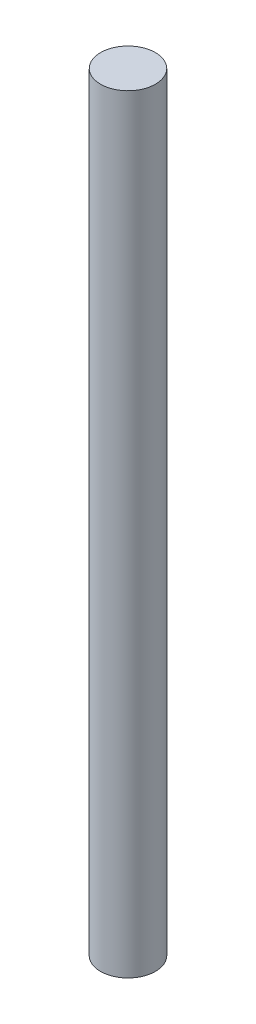
ISO-10303-21;
HEADER;
FILE_DESCRIPTION(('STEP AP214'),'2;1');
FILE_NAME('part.step','',(''),(''),'','','');
FILE_SCHEMA(('AUTOMOTIVE_DESIGN { 1 0 10303 214 1 1 1 1 }'));
ENDSEC;
DATA;
#1=APPLICATION_CONTEXT('core data for automotive mechanical design processes');
#2=APPLICATION_PROTOCOL_DEFINITION('international standard','automotive_design',2000,#1);
#3=PRODUCT_CONTEXT('',#1,'mechanical');
#4=PRODUCT('Part','Part','',(#3));
#5=PRODUCT_RELATED_PRODUCT_CATEGORY('part','',(#4));
#6=PRODUCT_DEFINITION_FORMATION('','',#4);
#7=PRODUCT_DEFINITION_CONTEXT('part definition',#1,'design');
#8=PRODUCT_DEFINITION('design','',#6,#7);
#9=PRODUCT_DEFINITION_SHAPE('','',#8);
#10=(LENGTH_UNIT() NAMED_UNIT(*) SI_UNIT(.MILLI.,.METRE.));
#11=(NAMED_UNIT(*) PLANE_ANGLE_UNIT() SI_UNIT($,.RADIAN.));
#12=(NAMED_UNIT(*) SI_UNIT($,.STERADIAN.) SOLID_ANGLE_UNIT());
#13=UNCERTAINTY_MEASURE_WITH_UNIT(LENGTH_MEASURE(1.E-05),#10,'distance_accuracy_value','');
#14=(GEOMETRIC_REPRESENTATION_CONTEXT(3) GLOBAL_UNCERTAINTY_ASSIGNED_CONTEXT((#13)) GLOBAL_UNIT_ASSIGNED_CONTEXT((#10,
#11,#12)) REPRESENTATION_CONTEXT('',''));
#15=CARTESIAN_POINT('',(0.,0.,0.));
#16=DIRECTION('',(0.,0.,1.));
#17=DIRECTION('',(1.,0.,0.));
#18=AXIS2_PLACEMENT_3D('',#15,#16,#17);
#19=CARTESIAN_POINT('',(0.,66.689,0.));
#20=DIRECTION('',(0.,-1.,0.));
#21=DIRECTION('',(0.,0.,-1.));
#22=AXIS2_PLACEMENT_3D('',#19,#20,#21);
#23=CYLINDRICAL_SURFACE('',#22,2.38);
#24=CARTESIAN_POINT('',(0.,66.689,0.));
#25=DIRECTION('',(0.,1.,0.));
#26=DIRECTION('',(0.,0.,1.));
#27=AXIS2_PLACEMENT_3D('',#24,#25,#26);
#28=CIRCLE('',#27,2.38);
#29=CARTESIAN_POINT('',(0.,66.689,2.38));
#30=VERTEX_POINT('',#29);
#31=EDGE_CURVE('E10',#30,#30,#28,.T.);
#32=ORIENTED_EDGE('',*,*,#31,.F.);
#33=EDGE_LOOP('',(#32));
#34=FACE_BOUND('',#33,.T.);
#35=CARTESIAN_POINT('',(0.,0.,0.));
#36=DIRECTION('',(0.,1.,0.));
#37=DIRECTION('',(0.,0.,1.));
#38=AXIS2_PLACEMENT_3D('',#35,#36,#37);
#39=CIRCLE('',#38,2.38);
#40=CARTESIAN_POINT('',(0.,0.,2.38));
#41=VERTEX_POINT('',#40);
#42=EDGE_CURVE('E34',#41,#41,#39,.T.);
#43=ORIENTED_EDGE('',*,*,#42,.T.);
#44=EDGE_LOOP('',(#43));
#45=FACE_BOUND('',#44,.T.);
#46=ADVANCED_FACE('F31',(#34,#45),#23,.T.);
#47=CARTESIAN_POINT('',(0.,66.689,0.));
#48=DIRECTION('',(0.,1.,0.));
#49=DIRECTION('',(0.,0.,1.));
#50=AXIS2_PLACEMENT_3D('',#47,#48,#49);
#51=PLANE('',#50);
#52=ORIENTED_EDGE('',*,*,#31,.T.);
#53=EDGE_LOOP('',(#52));
#54=FACE_BOUND('',#53,.T.);
#55=ADVANCED_FACE('F46',(#54),#51,.T.);
#56=CARTESIAN_POINT('',(0.,0.,0.));
#57=DIRECTION('',(0.,1.,0.));
#58=DIRECTION('',(0.,0.,1.));
#59=AXIS2_PLACEMENT_3D('',#56,#57,#58);
#60=PLANE('',#59);
#61=ORIENTED_EDGE('',*,*,#42,.F.);
#62=EDGE_LOOP('',(#61));
#63=FACE_BOUND('',#62,.T.);
#64=ADVANCED_FACE('F44',(#63),#60,.F.);
#65=CLOSED_SHELL('',(#46,#55,#64));
#66=MANIFOLD_SOLID_BREP('B2',#65);
#67=ADVANCED_BREP_SHAPE_REPRESENTATION('',(#18,#66),#14);
#68=SHAPE_DEFINITION_REPRESENTATION(#9,#67);
ENDSEC;
END-ISO-10303-21;
